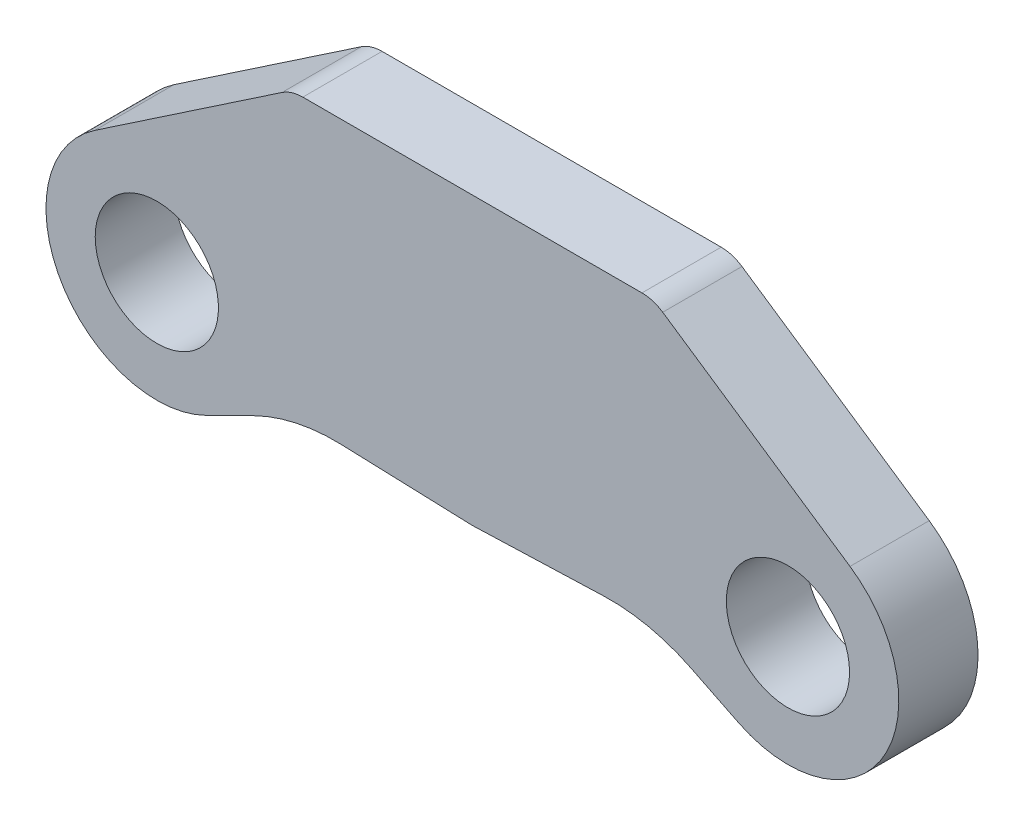
ISO-10303-21;
HEADER;
FILE_DESCRIPTION(('STEP AP214'),'2;1');
FILE_NAME('part.step','',(''),(''),'','','');
FILE_SCHEMA(('AUTOMOTIVE_DESIGN { 1 0 10303 214 1 1 1 1 }'));
ENDSEC;
DATA;
#1=APPLICATION_CONTEXT('core data for automotive mechanical design processes');
#2=APPLICATION_PROTOCOL_DEFINITION('international standard','automotive_design',2000,#1);
#3=PRODUCT_CONTEXT('',#1,'mechanical');
#4=PRODUCT('Part','Part','',(#3));
#5=PRODUCT_RELATED_PRODUCT_CATEGORY('part','',(#4));
#6=PRODUCT_DEFINITION_FORMATION('','',#4);
#7=PRODUCT_DEFINITION_CONTEXT('part definition',#1,'design');
#8=PRODUCT_DEFINITION('design','',#6,#7);
#9=PRODUCT_DEFINITION_SHAPE('','',#8);
#10=(LENGTH_UNIT() NAMED_UNIT(*) SI_UNIT(.MILLI.,.METRE.));
#11=(NAMED_UNIT(*) PLANE_ANGLE_UNIT() SI_UNIT($,.RADIAN.));
#12=(NAMED_UNIT(*) SI_UNIT($,.STERADIAN.) SOLID_ANGLE_UNIT());
#13=UNCERTAINTY_MEASURE_WITH_UNIT(LENGTH_MEASURE(1.E-05),#10,'distance_accuracy_value','');
#14=(GEOMETRIC_REPRESENTATION_CONTEXT(3) GLOBAL_UNCERTAINTY_ASSIGNED_CONTEXT((#13)) GLOBAL_UNIT_ASSIGNED_CONTEXT((#10,
#11,#12)) REPRESENTATION_CONTEXT('',''));
#15=CARTESIAN_POINT('',(0.,0.,0.));
#16=DIRECTION('',(0.,0.,1.));
#17=DIRECTION('',(1.,0.,0.));
#18=AXIS2_PLACEMENT_3D('',#15,#16,#17);
#19=CARTESIAN_POINT('',(21.3995324905659,14.364050526936,10.));
#20=DIRECTION('',(0.,0.,-1.));
#21=DIRECTION('',(-1.,0.,0.));
#22=AXIS2_PLACEMENT_3D('',#19,#20,#21);
#23=PLANE('',#22);
#24=DIRECTION('',(-1.,0.,0.));
#25=VECTOR('',#24,1.);
#26=CARTESIAN_POINT('',(0.,19.0521401573849,10.));
#27=LINE('',#26,#25);
#28=CARTESIAN_POINT('',(21.3995324905659,19.0521401573849,10.));
#29=VERTEX_POINT('',#28);
#30=CARTESIAN_POINT('',(-21.3995324905659,19.0521401573849,10.));
#31=VERTEX_POINT('',#30);
#32=EDGE_CURVE('E136',#29,#31,#27,.T.);
#33=ORIENTED_EDGE('',*,*,#32,.T.);
#34=CARTESIAN_POINT('',(-21.3995324905659,14.364050526936,10.));
#35=DIRECTION('',(0.,0.,-1.));
#36=DIRECTION('',(1.,0.,0.));
#37=AXIS2_PLACEMENT_3D('',#34,#35,#36);
#38=CIRCLE('',#37,4.6880896304489);
#39=CARTESIAN_POINT('',(-24.0233871852231,18.2490950472019,10.));
#40=VERTEX_POINT('',#39);
#41=EDGE_CURVE('E228',#40,#31,#38,.T.);
#42=ORIENTED_EDGE('',*,*,#41,.F.);
#43=DIRECTION('',(0.828705256621529,0.559685266598867,0.));
#44=VECTOR('',#43,1.);
#45=CARTESIAN_POINT('',(-24.0233871852231,18.2490950472019,10.));
#46=LINE('',#45,#44);
#47=CARTESIAN_POINT('',(-47.6576242765134,2.28716626539769,10.));
#48=VERTEX_POINT('',#47);
#49=EDGE_CURVE('E265',#48,#40,#46,.T.);
#50=ORIENTED_EDGE('',*,*,#49,.F.);
#51=CARTESIAN_POINT('',(-39.8271658880066,-9.3071036137174,10.));
#52=DIRECTION('',(0.,0.,-1.));
#53=DIRECTION('',(1.,0.,0.));
#54=AXIS2_PLACEMENT_3D('',#51,#52,#53);
#55=CIRCLE('',#54,13.9908245862741);
#56=CARTESIAN_POINT('',(-33.6266577518318,-21.8489085658414,10.));
#57=VERTEX_POINT('',#56);
#58=EDGE_CURVE('E261',#57,#48,#55,.T.);
#59=ORIENTED_EDGE('',*,*,#58,.F.);
#60=DIRECTION('',(-0.896430719632374,-0.443183895126373,0.));
#61=VECTOR('',#60,1.);
#62=CARTESIAN_POINT('',(-33.6266577518318,-21.8489085658414,10.));
#63=LINE('',#62,#61);
#64=CARTESIAN_POINT('',(-27.6053931492962,-18.8720722730907,10.));
#65=VERTEX_POINT('',#64);
#66=EDGE_CURVE('E257',#65,#57,#63,.T.);
#67=ORIENTED_EDGE('',*,*,#66,.F.);
#68=CARTESIAN_POINT('',(-17.3628521202045,-39.589721372128,10.));
#69=DIRECTION('',(0.,0.,1.));
#70=DIRECTION('',(-1.,0.,0.));
#71=AXIS2_PLACEMENT_3D('',#68,#69,#70);
#72=CIRCLE('',#71,23.1112663202056);
#73=CARTESIAN_POINT('',(-16.556211898125,-16.4925362086586,10.));
#74=VERTEX_POINT('',#73);
#75=EDGE_CURVE('E253',#74,#65,#72,.T.);
#76=ORIENTED_EDGE('',*,*,#75,.F.);
#77=DIRECTION('',(-0.999390723271453,0.034902467519676,0.));
#78=VECTOR('',#77,1.);
#79=CARTESIAN_POINT('',(-16.556211898125,-16.4925362086586,10.));
#80=LINE('',#79,#78);
#81=CARTESIAN_POINT('',(0.,-17.0707411434929,10.));
#82=VERTEX_POINT('',#81);
#83=EDGE_CURVE('E224',#82,#74,#80,.T.);
#84=ORIENTED_EDGE('',*,*,#83,.F.);
#85=DIRECTION('',(0.999390723271453,0.034902467519676,0.));
#86=VECTOR('',#85,1.);
#87=CARTESIAN_POINT('',(16.556211898125,-16.4925362086586,10.));
#88=LINE('',#87,#86);
#89=CARTESIAN_POINT('',(16.556211898125,-16.4925362086586,10.));
#90=VERTEX_POINT('',#89);
#91=EDGE_CURVE('E98',#82,#90,#88,.T.);
#92=ORIENTED_EDGE('',*,*,#91,.T.);
#93=CARTESIAN_POINT('',(17.3628521202045,-39.589721372128,10.));
#94=DIRECTION('',(0.,0.,-1.));
#95=DIRECTION('',(1.,0.,0.));
#96=AXIS2_PLACEMENT_3D('',#93,#94,#95);
#97=CIRCLE('',#96,23.1112663202056);
#98=CARTESIAN_POINT('',(27.6053931492962,-18.8720722730907,10.));
#99=VERTEX_POINT('',#98);
#100=EDGE_CURVE('E179',#90,#99,#97,.T.);
#101=ORIENTED_EDGE('',*,*,#100,.T.);
#102=DIRECTION('',(0.896430719632374,-0.443183895126373,0.));
#103=VECTOR('',#102,1.);
#104=CARTESIAN_POINT('',(33.6266577518318,-21.8489085658414,10.));
#105=LINE('',#104,#103);
#106=CARTESIAN_POINT('',(33.6266577518318,-21.8489085658414,10.));
#107=VERTEX_POINT('',#106);
#108=EDGE_CURVE('E118',#99,#107,#105,.T.);
#109=ORIENTED_EDGE('',*,*,#108,.T.);
#110=CARTESIAN_POINT('',(39.8271658880066,-9.3071036137174,10.));
#111=DIRECTION('',(0.,0.,1.));
#112=DIRECTION('',(-1.,0.,0.));
#113=AXIS2_PLACEMENT_3D('',#110,#111,#112);
#114=CIRCLE('',#113,13.9908245862741);
#115=CARTESIAN_POINT('',(47.6576242765134,2.28716626539769,10.));
#116=VERTEX_POINT('',#115);
#117=EDGE_CURVE('E112',#107,#116,#114,.T.);
#118=ORIENTED_EDGE('',*,*,#117,.T.);
#119=DIRECTION('',(-0.828705256621529,0.559685266598867,0.));
#120=VECTOR('',#119,1.);
#121=CARTESIAN_POINT('',(24.0233871852231,18.2490950472019,10.));
#122=LINE('',#121,#120);
#123=CARTESIAN_POINT('',(24.0233871852231,18.2490950472019,10.));
#124=VERTEX_POINT('',#123);
#125=EDGE_CURVE('E116',#116,#124,#122,.T.);
#126=ORIENTED_EDGE('',*,*,#125,.T.);
#127=CARTESIAN_POINT('',(21.3995324905659,14.364050526936,10.));
#128=DIRECTION('',(0.,0.,1.));
#129=DIRECTION('',(-1.,0.,0.));
#130=AXIS2_PLACEMENT_3D('',#127,#128,#129);
#131=CIRCLE('',#130,4.6880896304489);
#132=EDGE_CURVE('E57',#124,#29,#131,.T.);
#133=ORIENTED_EDGE('',*,*,#132,.T.);
#134=EDGE_LOOP('',(#33,#42,#50,#59,#67,#76,#84,#92,#101,#109,#118,#126,#133));
#135=FACE_BOUND('',#134,.T.);
#136=CARTESIAN_POINT('',(39.8271658880066,-9.3071036137174,10.));
#137=DIRECTION('',(0.,0.,1.));
#138=DIRECTION('',(1.,0.,0.));
#139=AXIS2_PLACEMENT_3D('',#136,#137,#138);
#140=CIRCLE('',#139,7.77566303226347);
#141=CARTESIAN_POINT('',(47.60282892027,-9.3071036137174,10.));
#142=VERTEX_POINT('',#141);
#143=EDGE_CURVE('E147',#142,#142,#140,.T.);
#144=ORIENTED_EDGE('',*,*,#143,.F.);
#145=EDGE_LOOP('',(#144));
#146=FACE_BOUND('',#145,.T.);
#147=CARTESIAN_POINT('',(-39.8271658880066,-9.3071036137174,10.));
#148=DIRECTION('',(0.,0.,-1.));
#149=DIRECTION('',(-1.,0.,0.));
#150=AXIS2_PLACEMENT_3D('',#147,#148,#149);
#151=CIRCLE('',#150,7.77566303226347);
#152=CARTESIAN_POINT('',(-47.60282892027,-9.3071036137174,10.));
#153=VERTEX_POINT('',#152);
#154=EDGE_CURVE('E249',#153,#153,#151,.T.);
#155=ORIENTED_EDGE('',*,*,#154,.T.);
#156=EDGE_LOOP('',(#155));
#157=FACE_BOUND('',#156,.T.);
#158=ADVANCED_FACE('F39',(#135,#146,#157),#23,.F.);
#159=CARTESIAN_POINT('',(21.3995324905659,14.364050526936,0.));
#160=DIRECTION('',(0.,0.,-1.));
#161=DIRECTION('',(-1.,0.,0.));
#162=AXIS2_PLACEMENT_3D('',#159,#160,#161);
#163=PLANE('',#162);
#164=DIRECTION('',(0.999390723271453,0.034902467519676,0.));
#165=VECTOR('',#164,1.);
#166=CARTESIAN_POINT('',(16.556211898125,-16.4925362086586,0.));
#167=LINE('',#166,#165);
#168=CARTESIAN_POINT('',(0.,-17.0707411434929,0.));
#169=VERTEX_POINT('',#168);
#170=CARTESIAN_POINT('',(16.556211898125,-16.4925362086586,0.));
#171=VERTEX_POINT('',#170);
#172=EDGE_CURVE('E143',#169,#171,#167,.T.);
#173=ORIENTED_EDGE('',*,*,#172,.F.);
#174=DIRECTION('',(-0.999390723271453,0.034902467519676,0.));
#175=VECTOR('',#174,1.);
#176=CARTESIAN_POINT('',(-16.556211898125,-16.4925362086586,0.));
#177=LINE('',#176,#175);
#178=CARTESIAN_POINT('',(-16.556211898125,-16.4925362086586,0.));
#179=VERTEX_POINT('',#178);
#180=EDGE_CURVE('E225',#169,#179,#177,.T.);
#181=ORIENTED_EDGE('',*,*,#180,.T.);
#182=CARTESIAN_POINT('',(-17.3628521202045,-39.589721372128,0.));
#183=DIRECTION('',(0.,0.,1.));
#184=DIRECTION('',(-1.,0.,0.));
#185=AXIS2_PLACEMENT_3D('',#182,#183,#184);
#186=CIRCLE('',#185,23.1112663202056);
#187=CARTESIAN_POINT('',(-27.6053931492962,-18.8720722730907,0.));
#188=VERTEX_POINT('',#187);
#189=EDGE_CURVE('E229',#179,#188,#186,.T.);
#190=ORIENTED_EDGE('',*,*,#189,.T.);
#191=DIRECTION('',(-0.896430719632374,-0.443183895126373,0.));
#192=VECTOR('',#191,1.);
#193=CARTESIAN_POINT('',(-33.6266577518318,-21.8489085658414,0.));
#194=LINE('',#193,#192);
#195=CARTESIAN_POINT('',(-33.6266577518318,-21.8489085658414,0.));
#196=VERTEX_POINT('',#195);
#197=EDGE_CURVE('E233',#188,#196,#194,.T.);
#198=ORIENTED_EDGE('',*,*,#197,.T.);
#199=CARTESIAN_POINT('',(-39.8271658880066,-9.3071036137174,0.));
#200=DIRECTION('',(0.,0.,-1.));
#201=DIRECTION('',(1.,0.,0.));
#202=AXIS2_PLACEMENT_3D('',#199,#200,#201);
#203=CIRCLE('',#202,13.9908245862741);
#204=CARTESIAN_POINT('',(-47.6576242765134,2.28716626539769,0.));
#205=VERTEX_POINT('',#204);
#206=EDGE_CURVE('E237',#196,#205,#203,.T.);
#207=ORIENTED_EDGE('',*,*,#206,.T.);
#208=DIRECTION('',(0.828705256621529,0.559685266598867,0.));
#209=VECTOR('',#208,1.);
#210=CARTESIAN_POINT('',(-24.0233871852231,18.2490950472019,0.));
#211=LINE('',#210,#209);
#212=CARTESIAN_POINT('',(-24.0233871852231,18.2490950472019,0.));
#213=VERTEX_POINT('',#212);
#214=EDGE_CURVE('E241',#205,#213,#211,.T.);
#215=ORIENTED_EDGE('',*,*,#214,.T.);
#216=CARTESIAN_POINT('',(-21.3995324905659,14.364050526936,0.));
#217=DIRECTION('',(0.,0.,-1.));
#218=DIRECTION('',(1.,0.,0.));
#219=AXIS2_PLACEMENT_3D('',#216,#217,#218);
#220=CIRCLE('',#219,4.6880896304489);
#221=CARTESIAN_POINT('',(-21.3995324905659,19.0521401573849,0.));
#222=VERTEX_POINT('',#221);
#223=EDGE_CURVE('E245',#213,#222,#220,.T.);
#224=ORIENTED_EDGE('',*,*,#223,.T.);
#225=DIRECTION('',(-1.,0.,0.));
#226=VECTOR('',#225,1.);
#227=CARTESIAN_POINT('',(0.,19.0521401573849,0.));
#228=LINE('',#227,#226);
#229=CARTESIAN_POINT('',(21.3995324905659,19.0521401573849,0.));
#230=VERTEX_POINT('',#229);
#231=EDGE_CURVE('E159',#230,#222,#228,.T.);
#232=ORIENTED_EDGE('',*,*,#231,.F.);
#233=CARTESIAN_POINT('',(21.3995324905659,14.364050526936,0.));
#234=DIRECTION('',(0.,0.,1.));
#235=DIRECTION('',(-1.,0.,0.));
#236=AXIS2_PLACEMENT_3D('',#233,#234,#235);
#237=CIRCLE('',#236,4.6880896304489);
#238=CARTESIAN_POINT('',(24.0233871852231,18.2490950472019,0.));
#239=VERTEX_POINT('',#238);
#240=EDGE_CURVE('E90',#239,#230,#237,.T.);
#241=ORIENTED_EDGE('',*,*,#240,.F.);
#242=DIRECTION('',(-0.828705256621529,0.559685266598867,0.));
#243=VECTOR('',#242,1.);
#244=CARTESIAN_POINT('',(24.0233871852231,18.2490950472019,0.));
#245=LINE('',#244,#243);
#246=CARTESIAN_POINT('',(47.6576242765134,2.28716626539769,0.));
#247=VERTEX_POINT('',#246);
#248=EDGE_CURVE('E84',#247,#239,#245,.T.);
#249=ORIENTED_EDGE('',*,*,#248,.F.);
#250=CARTESIAN_POINT('',(39.8271658880066,-9.3071036137174,0.));
#251=DIRECTION('',(0.,0.,1.));
#252=DIRECTION('',(-1.,0.,0.));
#253=AXIS2_PLACEMENT_3D('',#250,#251,#252);
#254=CIRCLE('',#253,13.9908245862741);
#255=CARTESIAN_POINT('',(33.6266577518318,-21.8489085658414,0.));
#256=VERTEX_POINT('',#255);
#257=EDGE_CURVE('E127',#256,#247,#254,.T.);
#258=ORIENTED_EDGE('',*,*,#257,.F.);
#259=DIRECTION('',(0.896430719632374,-0.443183895126373,0.));
#260=VECTOR('',#259,1.);
#261=CARTESIAN_POINT('',(33.6266577518318,-21.8489085658414,0.));
#262=LINE('',#261,#260);
#263=CARTESIAN_POINT('',(27.6053931492962,-18.8720722730907,0.));
#264=VERTEX_POINT('',#263);
#265=EDGE_CURVE('E150',#264,#256,#262,.T.);
#266=ORIENTED_EDGE('',*,*,#265,.F.);
#267=CARTESIAN_POINT('',(17.3628521202045,-39.589721372128,0.));
#268=DIRECTION('',(0.,0.,-1.));
#269=DIRECTION('',(1.,0.,0.));
#270=AXIS2_PLACEMENT_3D('',#267,#268,#269);
#271=CIRCLE('',#270,23.1112663202056);
#272=EDGE_CURVE('E146',#171,#264,#271,.T.);
#273=ORIENTED_EDGE('',*,*,#272,.F.);
#274=EDGE_LOOP('',(#173,#181,#190,#198,#207,#215,#224,#232,#241,#249,#258,#266,#273));
#275=FACE_BOUND('',#274,.T.);
#276=CARTESIAN_POINT('',(39.8271658880066,-9.3071036137174,0.));
#277=DIRECTION('',(0.,0.,1.));
#278=DIRECTION('',(1.,0.,0.));
#279=AXIS2_PLACEMENT_3D('',#276,#277,#278);
#280=CIRCLE('',#279,7.77566303226347);
#281=CARTESIAN_POINT('',(47.60282892027,-9.3071036137174,0.));
#282=VERTEX_POINT('',#281);
#283=EDGE_CURVE('E193',#282,#282,#280,.T.);
#284=ORIENTED_EDGE('',*,*,#283,.T.);
#285=EDGE_LOOP('',(#284));
#286=FACE_BOUND('',#285,.T.);
#287=CARTESIAN_POINT('',(-39.8271658880066,-9.3071036137174,0.));
#288=DIRECTION('',(0.,0.,-1.));
#289=DIRECTION('',(-1.,0.,0.));
#290=AXIS2_PLACEMENT_3D('',#287,#288,#289);
#291=CIRCLE('',#290,7.77566303226347);
#292=CARTESIAN_POINT('',(-47.60282892027,-9.3071036137174,0.));
#293=VERTEX_POINT('',#292);
#294=EDGE_CURVE('E272',#293,#293,#291,.T.);
#295=ORIENTED_EDGE('',*,*,#294,.F.);
#296=EDGE_LOOP('',(#295));
#297=FACE_BOUND('',#296,.T.);
#298=ADVANCED_FACE('F182',(#275,#286,#297),#163,.T.);
#299=CARTESIAN_POINT('',(16.556211898125,-16.4925362086586,10.));
#300=DIRECTION('',(-0.034902467519676,0.999390723271453,0.));
#301=DIRECTION('',(-0.999390723271453,-0.034902467519676,0.));
#302=AXIS2_PLACEMENT_3D('',#299,#300,#301);
#303=PLANE('',#302);
#304=ORIENTED_EDGE('',*,*,#172,.T.);
#305=DIRECTION('',(0.,0.,-1.));
#306=VECTOR('',#305,1.);
#307=CARTESIAN_POINT('',(16.556211898125,-16.4925362086586,10.));
#308=LINE('',#307,#306);
#309=EDGE_CURVE('E49',#90,#171,#308,.T.);
#310=ORIENTED_EDGE('',*,*,#309,.F.);
#311=ORIENTED_EDGE('',*,*,#91,.F.);
#312=DIRECTION('',(0.,0.,-1.));
#313=VECTOR('',#312,1.);
#314=CARTESIAN_POINT('',(0.,-17.0707411434929,10.));
#315=LINE('',#314,#313);
#316=EDGE_CURVE('E11',#82,#169,#315,.T.);
#317=ORIENTED_EDGE('',*,*,#316,.T.);
#318=EDGE_LOOP('',(#304,#310,#311,#317));
#319=FACE_BOUND('',#318,.T.);
#320=ADVANCED_FACE('F41',(#319),#303,.F.);
#321=CARTESIAN_POINT('',(17.3628521202045,-39.589721372128,10.));
#322=DIRECTION('',(0.,0.,-1.));
#323=DIRECTION('',(-1.,0.,0.));
#324=AXIS2_PLACEMENT_3D('',#321,#322,#323);
#325=CYLINDRICAL_SURFACE('',#324,23.1112663202056);
#326=ORIENTED_EDGE('',*,*,#272,.T.);
#327=DIRECTION('',(0.,0.,-1.));
#328=VECTOR('',#327,1.);
#329=CARTESIAN_POINT('',(27.6053931492962,-18.8720722730907,10.));
#330=LINE('',#329,#328);
#331=EDGE_CURVE('E169',#99,#264,#330,.T.);
#332=ORIENTED_EDGE('',*,*,#331,.F.);
#333=ORIENTED_EDGE('',*,*,#100,.F.);
#334=ORIENTED_EDGE('',*,*,#309,.T.);
#335=EDGE_LOOP('',(#326,#332,#333,#334));
#336=FACE_BOUND('',#335,.T.);
#337=ADVANCED_FACE('F177',(#336),#325,.F.);
#338=CARTESIAN_POINT('',(33.6266577518318,-21.8489085658414,10.));
#339=DIRECTION('',(0.443183895126373,0.896430719632374,0.));
#340=DIRECTION('',(-0.896430719632374,0.443183895126374,0.));
#341=AXIS2_PLACEMENT_3D('',#338,#339,#340);
#342=PLANE('',#341);
#343=ORIENTED_EDGE('',*,*,#265,.T.);
#344=DIRECTION('',(0.,0.,-1.));
#345=VECTOR('',#344,1.);
#346=CARTESIAN_POINT('',(33.6266577518318,-21.8489085658414,10.));
#347=LINE('',#346,#345);
#348=EDGE_CURVE('E129',#107,#256,#347,.T.);
#349=ORIENTED_EDGE('',*,*,#348,.F.);
#350=ORIENTED_EDGE('',*,*,#108,.F.);
#351=ORIENTED_EDGE('',*,*,#331,.T.);
#352=EDGE_LOOP('',(#343,#349,#350,#351));
#353=FACE_BOUND('',#352,.T.);
#354=ADVANCED_FACE('F186',(#353),#342,.F.);
#355=CARTESIAN_POINT('',(39.8271658880066,-9.3071036137174,10.));
#356=DIRECTION('',(0.,0.,-1.));
#357=DIRECTION('',(-1.,0.,0.));
#358=AXIS2_PLACEMENT_3D('',#355,#356,#357);
#359=CYLINDRICAL_SURFACE('',#358,13.9908245862741);
#360=ORIENTED_EDGE('',*,*,#257,.T.);
#361=DIRECTION('',(0.,0.,-1.));
#362=VECTOR('',#361,1.);
#363=CARTESIAN_POINT('',(47.6576242765134,2.28716626539769,10.));
#364=LINE('',#363,#362);
#365=EDGE_CURVE('E124',#116,#247,#364,.T.);
#366=ORIENTED_EDGE('',*,*,#365,.F.);
#367=ORIENTED_EDGE('',*,*,#117,.F.);
#368=ORIENTED_EDGE('',*,*,#348,.T.);
#369=EDGE_LOOP('',(#360,#366,#367,#368));
#370=FACE_BOUND('',#369,.T.);
#371=ADVANCED_FACE('F125',(#370),#359,.T.);
#372=CARTESIAN_POINT('',(24.0233871852231,18.2490950472019,10.));
#373=DIRECTION('',(-0.559685266598868,-0.828705256621529,0.));
#374=DIRECTION('',(0.828705256621529,-0.559685266598868,0.));
#375=AXIS2_PLACEMENT_3D('',#372,#373,#374);
#376=PLANE('',#375);
#377=ORIENTED_EDGE('',*,*,#248,.T.);
#378=DIRECTION('',(0.,0.,-1.));
#379=VECTOR('',#378,1.);
#380=CARTESIAN_POINT('',(24.0233871852231,18.2490950472019,10.));
#381=LINE('',#380,#379);
#382=EDGE_CURVE('E130',#124,#239,#381,.T.);
#383=ORIENTED_EDGE('',*,*,#382,.F.);
#384=ORIENTED_EDGE('',*,*,#125,.F.);
#385=ORIENTED_EDGE('',*,*,#365,.T.);
#386=EDGE_LOOP('',(#377,#383,#384,#385));
#387=FACE_BOUND('',#386,.T.);
#388=ADVANCED_FACE('F132',(#387),#376,.F.);
#389=CARTESIAN_POINT('',(21.3995324905659,14.364050526936,10.));
#390=DIRECTION('',(0.,0.,-1.));
#391=DIRECTION('',(-1.,0.,0.));
#392=AXIS2_PLACEMENT_3D('',#389,#390,#391);
#393=CYLINDRICAL_SURFACE('',#392,4.6880896304489);
#394=ORIENTED_EDGE('',*,*,#240,.T.);
#395=DIRECTION('',(0.,0.,-1.));
#396=VECTOR('',#395,1.);
#397=CARTESIAN_POINT('',(21.3995324905659,19.0521401573849,10.));
#398=LINE('',#397,#396);
#399=EDGE_CURVE('E142',#29,#230,#398,.T.);
#400=ORIENTED_EDGE('',*,*,#399,.F.);
#401=ORIENTED_EDGE('',*,*,#132,.F.);
#402=ORIENTED_EDGE('',*,*,#382,.T.);
#403=EDGE_LOOP('',(#394,#400,#401,#402));
#404=FACE_BOUND('',#403,.T.);
#405=ADVANCED_FACE('F301',(#404),#393,.T.);
#406=CARTESIAN_POINT('',(0.,19.0521401573849,10.));
#407=DIRECTION('',(0.,-1.,0.));
#408=DIRECTION('',(0.,0.,-1.));
#409=AXIS2_PLACEMENT_3D('',#406,#407,#408);
#410=PLANE('',#409);
#411=ORIENTED_EDGE('',*,*,#231,.T.);
#412=DIRECTION('',(0.,0.,-1.));
#413=VECTOR('',#412,1.);
#414=CARTESIAN_POINT('',(-21.3995324905659,19.0521401573849,10.));
#415=LINE('',#414,#413);
#416=EDGE_CURVE('E197',#31,#222,#415,.T.);
#417=ORIENTED_EDGE('',*,*,#416,.F.);
#418=ORIENTED_EDGE('',*,*,#32,.F.);
#419=ORIENTED_EDGE('',*,*,#399,.T.);
#420=EDGE_LOOP('',(#411,#417,#418,#419));
#421=FACE_BOUND('',#420,.T.);
#422=ADVANCED_FACE('F297',(#421),#410,.F.);
#423=CARTESIAN_POINT('',(39.8271658880066,-9.3071036137174,10.));
#424=DIRECTION('',(0.,0.,-1.));
#425=DIRECTION('',(-1.,0.,0.));
#426=AXIS2_PLACEMENT_3D('',#423,#424,#425);
#427=CYLINDRICAL_SURFACE('',#426,7.77566303226347);
#428=ORIENTED_EDGE('',*,*,#143,.T.);
#429=EDGE_LOOP('',(#428));
#430=FACE_BOUND('',#429,.T.);
#431=ORIENTED_EDGE('',*,*,#283,.F.);
#432=EDGE_LOOP('',(#431));
#433=FACE_BOUND('',#432,.T.);
#434=ADVANCED_FACE('F300',(#430,#433),#427,.F.);
#435=CARTESIAN_POINT('',(-21.3995324905659,14.364050526936,10.));
#436=DIRECTION('',(0.,0.,-1.));
#437=DIRECTION('',(-1.,0.,0.));
#438=AXIS2_PLACEMENT_3D('',#435,#436,#437);
#439=CYLINDRICAL_SURFACE('',#438,4.6880896304489);
#440=ORIENTED_EDGE('',*,*,#223,.F.);
#441=DIRECTION('',(0.,0.,-1.));
#442=VECTOR('',#441,1.);
#443=CARTESIAN_POINT('',(-24.0233871852231,18.2490950472019,10.));
#444=LINE('',#443,#442);
#445=EDGE_CURVE('E204',#40,#213,#444,.T.);
#446=ORIENTED_EDGE('',*,*,#445,.F.);
#447=ORIENTED_EDGE('',*,*,#41,.T.);
#448=ORIENTED_EDGE('',*,*,#416,.T.);
#449=EDGE_LOOP('',(#440,#446,#447,#448));
#450=FACE_BOUND('',#449,.T.);
#451=ADVANCED_FACE('F342',(#450),#439,.T.);
#452=CARTESIAN_POINT('',(-24.0233871852231,18.2490950472019,10.));
#453=DIRECTION('',(-0.559685266598868,0.828705256621529,0.));
#454=DIRECTION('',(-0.828705256621529,-0.559685266598868,0.));
#455=AXIS2_PLACEMENT_3D('',#452,#453,#454);
#456=PLANE('',#455);
#457=ORIENTED_EDGE('',*,*,#214,.F.);
#458=DIRECTION('',(0.,0.,-1.));
#459=VECTOR('',#458,1.);
#460=CARTESIAN_POINT('',(-47.6576242765134,2.28716626539769,10.));
#461=LINE('',#460,#459);
#462=EDGE_CURVE('E208',#48,#205,#461,.T.);
#463=ORIENTED_EDGE('',*,*,#462,.F.);
#464=ORIENTED_EDGE('',*,*,#49,.T.);
#465=ORIENTED_EDGE('',*,*,#445,.T.);
#466=EDGE_LOOP('',(#457,#463,#464,#465));
#467=FACE_BOUND('',#466,.T.);
#468=ADVANCED_FACE('F349',(#467),#456,.T.);
#469=CARTESIAN_POINT('',(-39.8271658880066,-9.3071036137174,10.));
#470=DIRECTION('',(0.,0.,-1.));
#471=DIRECTION('',(-1.,0.,0.));
#472=AXIS2_PLACEMENT_3D('',#469,#470,#471);
#473=CYLINDRICAL_SURFACE('',#472,13.9908245862741);
#474=ORIENTED_EDGE('',*,*,#206,.F.);
#475=DIRECTION('',(0.,0.,-1.));
#476=VECTOR('',#475,1.);
#477=CARTESIAN_POINT('',(-33.6266577518318,-21.8489085658414,10.));
#478=LINE('',#477,#476);
#479=EDGE_CURVE('E212',#57,#196,#478,.T.);
#480=ORIENTED_EDGE('',*,*,#479,.F.);
#481=ORIENTED_EDGE('',*,*,#58,.T.);
#482=ORIENTED_EDGE('',*,*,#462,.T.);
#483=EDGE_LOOP('',(#474,#480,#481,#482));
#484=FACE_BOUND('',#483,.T.);
#485=ADVANCED_FACE('F357',(#484),#473,.T.);
#486=CARTESIAN_POINT('',(-33.6266577518318,-21.8489085658414,10.));
#487=DIRECTION('',(0.443183895126373,-0.896430719632374,0.));
#488=DIRECTION('',(0.896430719632374,0.443183895126374,0.));
#489=AXIS2_PLACEMENT_3D('',#486,#487,#488);
#490=PLANE('',#489);
#491=ORIENTED_EDGE('',*,*,#197,.F.);
#492=DIRECTION('',(0.,0.,-1.));
#493=VECTOR('',#492,1.);
#494=CARTESIAN_POINT('',(-27.6053931492962,-18.8720722730907,10.));
#495=LINE('',#494,#493);
#496=EDGE_CURVE('E216',#65,#188,#495,.T.);
#497=ORIENTED_EDGE('',*,*,#496,.F.);
#498=ORIENTED_EDGE('',*,*,#66,.T.);
#499=ORIENTED_EDGE('',*,*,#479,.T.);
#500=EDGE_LOOP('',(#491,#497,#498,#499));
#501=FACE_BOUND('',#500,.T.);
#502=ADVANCED_FACE('F365',(#501),#490,.T.);
#503=CARTESIAN_POINT('',(-17.3628521202045,-39.589721372128,10.));
#504=DIRECTION('',(0.,0.,-1.));
#505=DIRECTION('',(-1.,0.,0.));
#506=AXIS2_PLACEMENT_3D('',#503,#504,#505);
#507=CYLINDRICAL_SURFACE('',#506,23.1112663202056);
#508=ORIENTED_EDGE('',*,*,#189,.F.);
#509=DIRECTION('',(0.,0.,-1.));
#510=VECTOR('',#509,1.);
#511=CARTESIAN_POINT('',(-16.556211898125,-16.4925362086586,10.));
#512=LINE('',#511,#510);
#513=EDGE_CURVE('E220',#74,#179,#512,.T.);
#514=ORIENTED_EDGE('',*,*,#513,.F.);
#515=ORIENTED_EDGE('',*,*,#75,.T.);
#516=ORIENTED_EDGE('',*,*,#496,.T.);
#517=EDGE_LOOP('',(#508,#514,#515,#516));
#518=FACE_BOUND('',#517,.T.);
#519=ADVANCED_FACE('F373',(#518),#507,.F.);
#520=CARTESIAN_POINT('',(-16.556211898125,-16.4925362086586,10.));
#521=DIRECTION('',(-0.034902467519676,-0.999390723271453,0.));
#522=DIRECTION('',(0.999390723271453,-0.034902467519676,0.));
#523=AXIS2_PLACEMENT_3D('',#520,#521,#522);
#524=PLANE('',#523);
#525=ORIENTED_EDGE('',*,*,#180,.F.);
#526=ORIENTED_EDGE('',*,*,#316,.F.);
#527=ORIENTED_EDGE('',*,*,#83,.T.);
#528=ORIENTED_EDGE('',*,*,#513,.T.);
#529=EDGE_LOOP('',(#525,#526,#527,#528));
#530=FACE_BOUND('',#529,.T.);
#531=ADVANCED_FACE('F284',(#530),#524,.T.);
#532=CARTESIAN_POINT('',(-39.8271658880066,-9.3071036137174,10.));
#533=DIRECTION('',(0.,0.,-1.));
#534=DIRECTION('',(-1.,0.,0.));
#535=AXIS2_PLACEMENT_3D('',#532,#533,#534);
#536=CYLINDRICAL_SURFACE('',#535,7.77566303226347);
#537=ORIENTED_EDGE('',*,*,#154,.F.);
#538=EDGE_LOOP('',(#537));
#539=FACE_BOUND('',#538,.T.);
#540=ORIENTED_EDGE('',*,*,#294,.T.);
#541=EDGE_LOOP('',(#540));
#542=FACE_BOUND('',#541,.T.);
#543=ADVANCED_FACE('F281',(#539,#542),#536,.F.);
#544=CLOSED_SHELL('',(#158,#298,#320,#337,#354,#371,#388,#405,#422,#434,#451,#468,#485,#502,
#519,#531,#543));
#545=MANIFOLD_SOLID_BREP('B2',#544);
#546=ADVANCED_BREP_SHAPE_REPRESENTATION('',(#18,#545),#14);
#547=SHAPE_DEFINITION_REPRESENTATION(#9,#546);
ENDSEC;
END-ISO-10303-21;
